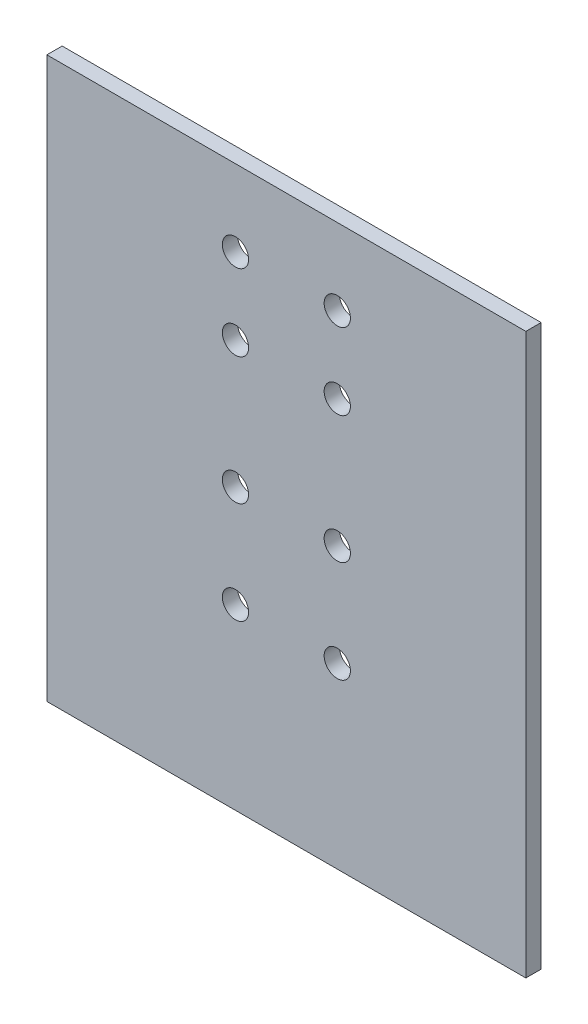
ISO-10303-21;
HEADER;
FILE_DESCRIPTION(('STEP AP214'),'2;1');
FILE_NAME('part.step','',(''),(''),'','','');
FILE_SCHEMA(('AUTOMOTIVE_DESIGN { 1 0 10303 214 1 1 1 1 }'));
ENDSEC;
DATA;
#1=APPLICATION_CONTEXT('core data for automotive mechanical design processes');
#2=APPLICATION_PROTOCOL_DEFINITION('international standard','automotive_design',2000,#1);
#3=PRODUCT_CONTEXT('',#1,'mechanical');
#4=PRODUCT('Part','Part','',(#3));
#5=PRODUCT_RELATED_PRODUCT_CATEGORY('part','',(#4));
#6=PRODUCT_DEFINITION_FORMATION('','',#4);
#7=PRODUCT_DEFINITION_CONTEXT('part definition',#1,'design');
#8=PRODUCT_DEFINITION('design','',#6,#7);
#9=PRODUCT_DEFINITION_SHAPE('','',#8);
#10=(LENGTH_UNIT() NAMED_UNIT(*) SI_UNIT(.MILLI.,.METRE.));
#11=(NAMED_UNIT(*) PLANE_ANGLE_UNIT() SI_UNIT($,.RADIAN.));
#12=(NAMED_UNIT(*) SI_UNIT($,.STERADIAN.) SOLID_ANGLE_UNIT());
#13=UNCERTAINTY_MEASURE_WITH_UNIT(LENGTH_MEASURE(1.E-05),#10,'distance_accuracy_value','');
#14=(GEOMETRIC_REPRESENTATION_CONTEXT(3) GLOBAL_UNCERTAINTY_ASSIGNED_CONTEXT((#13)) GLOBAL_UNIT_ASSIGNED_CONTEXT((#10,
#11,#12)) REPRESENTATION_CONTEXT('',''));
#15=CARTESIAN_POINT('',(0.,0.,0.));
#16=DIRECTION('',(0.,0.,1.));
#17=DIRECTION('',(1.,0.,0.));
#18=AXIS2_PLACEMENT_3D('',#15,#16,#17);
#19=CARTESIAN_POINT('',(0.,0.,-3.));
#20=DIRECTION('',(0.,0.,1.));
#21=DIRECTION('',(1.,0.,0.));
#22=AXIS2_PLACEMENT_3D('',#19,#20,#21);
#23=PLANE('',#22);
#24=CARTESIAN_POINT('',(10.,0.,-3.));
#25=DIRECTION('',(0.,0.,1.));
#26=DIRECTION('',(1.,0.,0.));
#27=AXIS2_PLACEMENT_3D('',#24,#25,#26);
#28=CIRCLE('',#27,2.58);
#29=CARTESIAN_POINT('',(12.58,0.,-3.));
#30=VERTEX_POINT('',#29);
#31=EDGE_CURVE('E200',#30,#30,#28,.T.);
#32=ORIENTED_EDGE('',*,*,#31,.T.);
#33=EDGE_LOOP('',(#32));
#34=FACE_BOUND('',#33,.T.);
#35=CARTESIAN_POINT('',(10.,25.,-3.));
#36=DIRECTION('',(0.,0.,1.));
#37=DIRECTION('',(1.,0.,0.));
#38=AXIS2_PLACEMENT_3D('',#35,#36,#37);
#39=CIRCLE('',#38,2.58);
#40=CARTESIAN_POINT('',(12.58,25.,-3.));
#41=VERTEX_POINT('',#40);
#42=EDGE_CURVE('E191',#41,#41,#39,.T.);
#43=ORIENTED_EDGE('',*,*,#42,.T.);
#44=EDGE_LOOP('',(#43));
#45=FACE_BOUND('',#44,.T.);
#46=CARTESIAN_POINT('',(-10.,25.,-3.));
#47=DIRECTION('',(0.,0.,1.));
#48=DIRECTION('',(1.,0.,0.));
#49=AXIS2_PLACEMENT_3D('',#46,#47,#48);
#50=CIRCLE('',#49,2.58);
#51=CARTESIAN_POINT('',(-7.42,25.,-3.));
#52=VERTEX_POINT('',#51);
#53=EDGE_CURVE('E216',#52,#52,#50,.T.);
#54=ORIENTED_EDGE('',*,*,#53,.T.);
#55=EDGE_LOOP('',(#54));
#56=FACE_BOUND('',#55,.T.);
#57=CARTESIAN_POINT('',(10.,40.,-3.));
#58=DIRECTION('',(0.,0.,1.));
#59=DIRECTION('',(1.,0.,0.));
#60=AXIS2_PLACEMENT_3D('',#57,#58,#59);
#61=CIRCLE('',#60,2.58);
#62=CARTESIAN_POINT('',(12.58,40.,-3.));
#63=VERTEX_POINT('',#62);
#64=EDGE_CURVE('E207',#63,#63,#61,.T.);
#65=ORIENTED_EDGE('',*,*,#64,.T.);
#66=EDGE_LOOP('',(#65));
#67=FACE_BOUND('',#66,.T.);
#68=CARTESIAN_POINT('',(-10.,0.,-3.));
#69=DIRECTION('',(0.,0.,1.));
#70=DIRECTION('',(1.,0.,0.));
#71=AXIS2_PLACEMENT_3D('',#68,#69,#70);
#72=CIRCLE('',#71,2.58);
#73=CARTESIAN_POINT('',(-7.42,0.,-3.));
#74=VERTEX_POINT('',#73);
#75=EDGE_CURVE('E167',#74,#74,#72,.T.);
#76=ORIENTED_EDGE('',*,*,#75,.T.);
#77=EDGE_LOOP('',(#76));
#78=FACE_BOUND('',#77,.T.);
#79=CARTESIAN_POINT('',(-10.,-20.,-3.));
#80=DIRECTION('',(0.,0.,1.));
#81=DIRECTION('',(1.,0.,0.));
#82=AXIS2_PLACEMENT_3D('',#79,#80,#81);
#83=CIRCLE('',#82,2.58);
#84=CARTESIAN_POINT('',(-7.42,-20.,-3.));
#85=VERTEX_POINT('',#84);
#86=EDGE_CURVE('E176',#85,#85,#83,.T.);
#87=ORIENTED_EDGE('',*,*,#86,.T.);
#88=EDGE_LOOP('',(#87));
#89=FACE_BOUND('',#88,.T.);
#90=CARTESIAN_POINT('',(10.,-20.,-3.));
#91=DIRECTION('',(0.,0.,1.));
#92=DIRECTION('',(1.,0.,0.));
#93=AXIS2_PLACEMENT_3D('',#90,#91,#92);
#94=CIRCLE('',#93,2.58);
#95=CARTESIAN_POINT('',(12.58,-20.,-3.));
#96=VERTEX_POINT('',#95);
#97=EDGE_CURVE('E184',#96,#96,#94,.T.);
#98=ORIENTED_EDGE('',*,*,#97,.T.);
#99=EDGE_LOOP('',(#98));
#100=FACE_BOUND('',#99,.T.);
#101=CARTESIAN_POINT('',(-10.,40.,-3.));
#102=DIRECTION('',(0.,0.,1.));
#103=DIRECTION('',(1.,0.,0.));
#104=AXIS2_PLACEMENT_3D('',#101,#102,#103);
#105=CIRCLE('',#104,2.58);
#106=CARTESIAN_POINT('',(-7.42,40.,-3.));
#107=VERTEX_POINT('',#106);
#108=EDGE_CURVE('E137',#107,#107,#105,.T.);
#109=ORIENTED_EDGE('',*,*,#108,.T.);
#110=EDGE_LOOP('',(#109));
#111=FACE_BOUND('',#110,.T.);
#112=DIRECTION('',(-1.,0.,0.));
#113=VECTOR('',#112,1.);
#114=CARTESIAN_POINT('',(-43.,55.,-3.));
#115=LINE('',#114,#113);
#116=CARTESIAN_POINT('',(47.0400430645095,55.,-3.00000000000004));
#117=VERTEX_POINT('',#116);
#118=CARTESIAN_POINT('',(-47.0400430645095,55.,-3.00000000000007));
#119=VERTEX_POINT('',#118);
#120=EDGE_CURVE('E96',#117,#119,#115,.T.);
#121=ORIENTED_EDGE('',*,*,#120,.F.);
#122=DIRECTION('',(0.,-1.,0.));
#123=VECTOR('',#122,1.);
#124=CARTESIAN_POINT('',(47.0400430645095,0.,-3.00000000000005));
#125=LINE('',#124,#123);
#126=CARTESIAN_POINT('',(47.0400430645095,-55.,-3.00000000000006));
#127=VERTEX_POINT('',#126);
#128=EDGE_CURVE('E162',#117,#127,#125,.T.);
#129=ORIENTED_EDGE('',*,*,#128,.T.);
#130=DIRECTION('',(1.,0.,0.));
#131=VECTOR('',#130,1.);
#132=CARTESIAN_POINT('',(-43.,-55.,-3.));
#133=LINE('',#132,#131);
#134=CARTESIAN_POINT('',(-47.0400430645094,-55.,-3.00000000000004));
#135=VERTEX_POINT('',#134);
#136=EDGE_CURVE('E13',#135,#127,#133,.T.);
#137=ORIENTED_EDGE('',*,*,#136,.F.);
#138=DIRECTION('',(0.,1.,0.));
#139=VECTOR('',#138,1.);
#140=CARTESIAN_POINT('',(-47.0400430645095,0.,-3.00000000000005));
#141=LINE('',#140,#139);
#142=EDGE_CURVE('E148',#135,#119,#141,.T.);
#143=ORIENTED_EDGE('',*,*,#142,.T.);
#144=EDGE_LOOP('',(#121,#129,#137,#143));
#145=FACE_BOUND('',#144,.T.);
#146=ADVANCED_FACE('F85',(#34,#45,#56,#67,#78,#89,#100,#111,#145),#23,.F.);
#147=CARTESIAN_POINT('',(0.,0.,0.));
#148=DIRECTION('',(0.,0.,1.));
#149=DIRECTION('',(1.,0.,0.));
#150=AXIS2_PLACEMENT_3D('',#147,#148,#149);
#151=PLANE('',#150);
#152=CARTESIAN_POINT('',(10.,0.,0.));
#153=DIRECTION('',(0.,0.,1.));
#154=DIRECTION('',(1.,0.,0.));
#155=AXIS2_PLACEMENT_3D('',#152,#153,#154);
#156=CIRCLE('',#155,2.58);
#157=CARTESIAN_POINT('',(12.58,0.,0.));
#158=VERTEX_POINT('',#157);
#159=EDGE_CURVE('E171',#158,#158,#156,.T.);
#160=ORIENTED_EDGE('',*,*,#159,.F.);
#161=EDGE_LOOP('',(#160));
#162=FACE_BOUND('',#161,.T.);
#163=CARTESIAN_POINT('',(10.,25.,0.));
#164=DIRECTION('',(0.,0.,1.));
#165=DIRECTION('',(1.,0.,0.));
#166=AXIS2_PLACEMENT_3D('',#163,#164,#165);
#167=CIRCLE('',#166,2.58);
#168=CARTESIAN_POINT('',(12.58,25.,0.));
#169=VERTEX_POINT('',#168);
#170=EDGE_CURVE('E196',#169,#169,#167,.T.);
#171=ORIENTED_EDGE('',*,*,#170,.F.);
#172=EDGE_LOOP('',(#171));
#173=FACE_BOUND('',#172,.T.);
#174=CARTESIAN_POINT('',(-10.,25.,0.));
#175=DIRECTION('',(0.,0.,1.));
#176=DIRECTION('',(1.,0.,0.));
#177=AXIS2_PLACEMENT_3D('',#174,#175,#176);
#178=CIRCLE('',#177,2.58);
#179=CARTESIAN_POINT('',(-7.42,25.,0.));
#180=VERTEX_POINT('',#179);
#181=EDGE_CURVE('E195',#180,#180,#178,.T.);
#182=ORIENTED_EDGE('',*,*,#181,.F.);
#183=EDGE_LOOP('',(#182));
#184=FACE_BOUND('',#183,.T.);
#185=CARTESIAN_POINT('',(10.,40.,0.));
#186=DIRECTION('',(0.,0.,1.));
#187=DIRECTION('',(1.,0.,0.));
#188=AXIS2_PLACEMENT_3D('',#185,#186,#187);
#189=CIRCLE('',#188,2.58);
#190=CARTESIAN_POINT('',(12.58,40.,0.));
#191=VERTEX_POINT('',#190);
#192=EDGE_CURVE('E212',#191,#191,#189,.T.);
#193=ORIENTED_EDGE('',*,*,#192,.F.);
#194=EDGE_LOOP('',(#193));
#195=FACE_BOUND('',#194,.T.);
#196=CARTESIAN_POINT('',(-10.,0.,0.));
#197=DIRECTION('',(0.,0.,1.));
#198=DIRECTION('',(1.,0.,0.));
#199=AXIS2_PLACEMENT_3D('',#196,#197,#198);
#200=CIRCLE('',#199,2.58);
#201=CARTESIAN_POINT('',(-7.42,0.,0.));
#202=VERTEX_POINT('',#201);
#203=EDGE_CURVE('E172',#202,#202,#200,.T.);
#204=ORIENTED_EDGE('',*,*,#203,.F.);
#205=EDGE_LOOP('',(#204));
#206=FACE_BOUND('',#205,.T.);
#207=CARTESIAN_POINT('',(-10.,-20.,0.));
#208=DIRECTION('',(0.,0.,1.));
#209=DIRECTION('',(1.,0.,0.));
#210=AXIS2_PLACEMENT_3D('',#207,#208,#209);
#211=CIRCLE('',#210,2.58);
#212=CARTESIAN_POINT('',(-7.42,-20.,0.));
#213=VERTEX_POINT('',#212);
#214=EDGE_CURVE('E180',#213,#213,#211,.T.);
#215=ORIENTED_EDGE('',*,*,#214,.F.);
#216=EDGE_LOOP('',(#215));
#217=FACE_BOUND('',#216,.T.);
#218=CARTESIAN_POINT('',(10.,-20.,0.));
#219=DIRECTION('',(0.,0.,1.));
#220=DIRECTION('',(1.,0.,0.));
#221=AXIS2_PLACEMENT_3D('',#218,#219,#220);
#222=CIRCLE('',#221,2.58);
#223=CARTESIAN_POINT('',(12.58,-20.,0.));
#224=VERTEX_POINT('',#223);
#225=EDGE_CURVE('E161',#224,#224,#222,.T.);
#226=ORIENTED_EDGE('',*,*,#225,.F.);
#227=EDGE_LOOP('',(#226));
#228=FACE_BOUND('',#227,.T.);
#229=CARTESIAN_POINT('',(-10.,40.,0.));
#230=DIRECTION('',(0.,0.,1.));
#231=DIRECTION('',(1.,0.,0.));
#232=AXIS2_PLACEMENT_3D('',#229,#230,#231);
#233=CIRCLE('',#232,2.58);
#234=CARTESIAN_POINT('',(-7.42,40.,0.));
#235=VERTEX_POINT('',#234);
#236=EDGE_CURVE('E211',#235,#235,#233,.T.);
#237=ORIENTED_EDGE('',*,*,#236,.F.);
#238=EDGE_LOOP('',(#237));
#239=FACE_BOUND('',#238,.T.);
#240=DIRECTION('',(1.,0.,0.));
#241=VECTOR('',#240,1.);
#242=CARTESIAN_POINT('',(-43.,-55.,0.));
#243=LINE('',#242,#241);
#244=CARTESIAN_POINT('',(-47.0400430645095,-55.,0.));
#245=VERTEX_POINT('',#244);
#246=CARTESIAN_POINT('',(47.0400430645095,-55.,0.));
#247=VERTEX_POINT('',#246);
#248=EDGE_CURVE('E89',#245,#247,#243,.T.);
#249=ORIENTED_EDGE('',*,*,#248,.T.);
#250=DIRECTION('',(0.,1.,0.));
#251=VECTOR('',#250,1.);
#252=CARTESIAN_POINT('',(47.0400430645095,-55.,0.));
#253=LINE('',#252,#251);
#254=CARTESIAN_POINT('',(47.0400430645095,55.,0.));
#255=VERTEX_POINT('',#254);
#256=EDGE_CURVE('E135',#255,#247,#253,.F.);
#257=ORIENTED_EDGE('',*,*,#256,.F.);
#258=DIRECTION('',(-1.,0.,0.));
#259=VECTOR('',#258,1.);
#260=CARTESIAN_POINT('',(-43.,55.,0.));
#261=LINE('',#260,#259);
#262=CARTESIAN_POINT('',(-47.0400430645095,55.,0.));
#263=VERTEX_POINT('',#262);
#264=EDGE_CURVE('E105',#255,#263,#261,.T.);
#265=ORIENTED_EDGE('',*,*,#264,.T.);
#266=DIRECTION('',(0.,-1.,0.));
#267=VECTOR('',#266,1.);
#268=CARTESIAN_POINT('',(-47.0400430645095,55.,0.));
#269=LINE('',#268,#267);
#270=EDGE_CURVE('E134',#245,#263,#269,.F.);
#271=ORIENTED_EDGE('',*,*,#270,.F.);
#272=EDGE_LOOP('',(#249,#257,#265,#271));
#273=FACE_BOUND('',#272,.T.);
#274=ADVANCED_FACE('F87',(#162,#173,#184,#195,#206,#217,#228,#239,#273),#151,.T.);
#275=CARTESIAN_POINT('',(-43.,55.,-3.));
#276=DIRECTION('',(0.,1.,0.));
#277=DIRECTION('',(0.,0.,1.));
#278=AXIS2_PLACEMENT_3D('',#275,#276,#277);
#279=PLANE('',#278);
#280=ORIENTED_EDGE('',*,*,#264,.F.);
#281=DIRECTION('',(0.,0.,1.));
#282=VECTOR('',#281,1.);
#283=CARTESIAN_POINT('',(47.0400430645095,55.,-3.00000000000004));
#284=LINE('',#283,#282);
#285=EDGE_CURVE('E152',#117,#255,#284,.T.);
#286=ORIENTED_EDGE('',*,*,#285,.F.);
#287=ORIENTED_EDGE('',*,*,#120,.T.);
#288=DIRECTION('',(0.,0.,1.));
#289=VECTOR('',#288,1.);
#290=CARTESIAN_POINT('',(-47.0400430645095,55.,-3.00000000000007));
#291=LINE('',#290,#289);
#292=EDGE_CURVE('E142',#119,#263,#291,.T.);
#293=ORIENTED_EDGE('',*,*,#292,.T.);
#294=EDGE_LOOP('',(#280,#286,#287,#293));
#295=FACE_BOUND('',#294,.T.);
#296=ADVANCED_FACE('F146',(#295),#279,.T.);
#297=CARTESIAN_POINT('',(-43.,-55.,-3.));
#298=DIRECTION('',(0.,-1.,0.));
#299=DIRECTION('',(0.,0.,-1.));
#300=AXIS2_PLACEMENT_3D('',#297,#298,#299);
#301=PLANE('',#300);
#302=ORIENTED_EDGE('',*,*,#136,.T.);
#303=DIRECTION('',(0.,0.,1.));
#304=VECTOR('',#303,1.);
#305=CARTESIAN_POINT('',(47.0400430645095,-55.,-3.00000000000006));
#306=LINE('',#305,#304);
#307=EDGE_CURVE('E158',#127,#247,#306,.T.);
#308=ORIENTED_EDGE('',*,*,#307,.T.);
#309=ORIENTED_EDGE('',*,*,#248,.F.);
#310=DIRECTION('',(0.,0.,1.));
#311=VECTOR('',#310,1.);
#312=CARTESIAN_POINT('',(-47.0400430645094,-55.,-3.00000000000004));
#313=LINE('',#312,#311);
#314=EDGE_CURVE('E143',#135,#245,#313,.T.);
#315=ORIENTED_EDGE('',*,*,#314,.F.);
#316=EDGE_LOOP('',(#302,#308,#309,#315));
#317=FACE_BOUND('',#316,.T.);
#318=ADVANCED_FACE('F241',(#317),#301,.T.);
#319=CARTESIAN_POINT('',(-10.,40.,-3.));
#320=DIRECTION('',(0.,0.,1.));
#321=DIRECTION('',(1.,0.,0.));
#322=AXIS2_PLACEMENT_3D('',#319,#320,#321);
#323=CYLINDRICAL_SURFACE('',#322,2.58);
#324=ORIENTED_EDGE('',*,*,#108,.F.);
#325=EDGE_LOOP('',(#324));
#326=FACE_BOUND('',#325,.T.);
#327=ORIENTED_EDGE('',*,*,#236,.T.);
#328=EDGE_LOOP('',(#327));
#329=FACE_BOUND('',#328,.T.);
#330=ADVANCED_FACE('F233',(#326,#329),#323,.F.);
#331=CARTESIAN_POINT('',(10.,-20.,-3.));
#332=DIRECTION('',(0.,0.,1.));
#333=DIRECTION('',(1.,0.,0.));
#334=AXIS2_PLACEMENT_3D('',#331,#332,#333);
#335=CYLINDRICAL_SURFACE('',#334,2.58);
#336=ORIENTED_EDGE('',*,*,#97,.F.);
#337=EDGE_LOOP('',(#336));
#338=FACE_BOUND('',#337,.T.);
#339=ORIENTED_EDGE('',*,*,#225,.T.);
#340=EDGE_LOOP('',(#339));
#341=FACE_BOUND('',#340,.T.);
#342=ADVANCED_FACE('F258',(#338,#341),#335,.F.);
#343=CARTESIAN_POINT('',(-10.,-20.,-3.));
#344=DIRECTION('',(0.,0.,1.));
#345=DIRECTION('',(1.,0.,0.));
#346=AXIS2_PLACEMENT_3D('',#343,#344,#345);
#347=CYLINDRICAL_SURFACE('',#346,2.58);
#348=ORIENTED_EDGE('',*,*,#86,.F.);
#349=EDGE_LOOP('',(#348));
#350=FACE_BOUND('',#349,.T.);
#351=ORIENTED_EDGE('',*,*,#214,.T.);
#352=EDGE_LOOP('',(#351));
#353=FACE_BOUND('',#352,.T.);
#354=ADVANCED_FACE('F260',(#350,#353),#347,.F.);
#355=CARTESIAN_POINT('',(-10.,0.,-3.));
#356=DIRECTION('',(0.,0.,1.));
#357=DIRECTION('',(1.,0.,0.));
#358=AXIS2_PLACEMENT_3D('',#355,#356,#357);
#359=CYLINDRICAL_SURFACE('',#358,2.58);
#360=ORIENTED_EDGE('',*,*,#75,.F.);
#361=EDGE_LOOP('',(#360));
#362=FACE_BOUND('',#361,.T.);
#363=ORIENTED_EDGE('',*,*,#203,.T.);
#364=EDGE_LOOP('',(#363));
#365=FACE_BOUND('',#364,.T.);
#366=ADVANCED_FACE('F267',(#362,#365),#359,.F.);
#367=CARTESIAN_POINT('',(10.,40.,-3.));
#368=DIRECTION('',(0.,0.,1.));
#369=DIRECTION('',(1.,0.,0.));
#370=AXIS2_PLACEMENT_3D('',#367,#368,#369);
#371=CYLINDRICAL_SURFACE('',#370,2.58);
#372=ORIENTED_EDGE('',*,*,#64,.F.);
#373=EDGE_LOOP('',(#372));
#374=FACE_BOUND('',#373,.T.);
#375=ORIENTED_EDGE('',*,*,#192,.T.);
#376=EDGE_LOOP('',(#375));
#377=FACE_BOUND('',#376,.T.);
#378=ADVANCED_FACE('F285',(#374,#377),#371,.F.);
#379=CARTESIAN_POINT('',(-10.,25.,-3.));
#380=DIRECTION('',(0.,0.,1.));
#381=DIRECTION('',(1.,0.,0.));
#382=AXIS2_PLACEMENT_3D('',#379,#380,#381);
#383=CYLINDRICAL_SURFACE('',#382,2.58);
#384=ORIENTED_EDGE('',*,*,#53,.F.);
#385=EDGE_LOOP('',(#384));
#386=FACE_BOUND('',#385,.T.);
#387=ORIENTED_EDGE('',*,*,#181,.T.);
#388=EDGE_LOOP('',(#387));
#389=FACE_BOUND('',#388,.T.);
#390=ADVANCED_FACE('F279',(#386,#389),#383,.F.);
#391=CARTESIAN_POINT('',(10.,25.,-3.));
#392=DIRECTION('',(0.,0.,1.));
#393=DIRECTION('',(1.,0.,0.));
#394=AXIS2_PLACEMENT_3D('',#391,#392,#393);
#395=CYLINDRICAL_SURFACE('',#394,2.58);
#396=ORIENTED_EDGE('',*,*,#42,.F.);
#397=EDGE_LOOP('',(#396));
#398=FACE_BOUND('',#397,.T.);
#399=ORIENTED_EDGE('',*,*,#170,.T.);
#400=EDGE_LOOP('',(#399));
#401=FACE_BOUND('',#400,.T.);
#402=ADVANCED_FACE('F275',(#398,#401),#395,.F.);
#403=CARTESIAN_POINT('',(10.,0.,-3.));
#404=DIRECTION('',(0.,0.,1.));
#405=DIRECTION('',(1.,0.,0.));
#406=AXIS2_PLACEMENT_3D('',#403,#404,#405);
#407=CYLINDRICAL_SURFACE('',#406,2.58);
#408=ORIENTED_EDGE('',*,*,#31,.F.);
#409=EDGE_LOOP('',(#408));
#410=FACE_BOUND('',#409,.T.);
#411=ORIENTED_EDGE('',*,*,#159,.T.);
#412=EDGE_LOOP('',(#411));
#413=FACE_BOUND('',#412,.T.);
#414=ADVANCED_FACE('F278',(#410,#413),#407,.F.);
#415=CARTESIAN_POINT('',(47.0400430645095,-55.,-3.00000000000006));
#416=DIRECTION('',(-1.,0.,0.));
#417=DIRECTION('',(0.,0.,1.));
#418=AXIS2_PLACEMENT_3D('',#415,#416,#417);
#419=PLANE('',#418);
#420=ORIENTED_EDGE('',*,*,#256,.T.);
#421=ORIENTED_EDGE('',*,*,#307,.F.);
#422=ORIENTED_EDGE('',*,*,#128,.F.);
#423=ORIENTED_EDGE('',*,*,#285,.T.);
#424=EDGE_LOOP('',(#420,#421,#422,#423));
#425=FACE_BOUND('',#424,.T.);
#426=ADVANCED_FACE('F283',(#425),#419,.F.);
#427=CARTESIAN_POINT('',(-47.0400430645095,55.,-3.00000000000007));
#428=DIRECTION('',(1.,0.,0.));
#429=DIRECTION('',(0.,0.,-1.));
#430=AXIS2_PLACEMENT_3D('',#427,#428,#429);
#431=PLANE('',#430);
#432=ORIENTED_EDGE('',*,*,#270,.T.);
#433=ORIENTED_EDGE('',*,*,#292,.F.);
#434=ORIENTED_EDGE('',*,*,#142,.F.);
#435=ORIENTED_EDGE('',*,*,#314,.T.);
#436=EDGE_LOOP('',(#432,#433,#434,#435));
#437=FACE_BOUND('',#436,.T.);
#438=ADVANCED_FACE('F140',(#437),#431,.F.);
#439=CLOSED_SHELL('',(#146,#274,#296,#318,#330,#342,#354,#366,#378,#390,#402,#414,#426,#438));
#440=MANIFOLD_SOLID_BREP('B2',#439);
#441=ADVANCED_BREP_SHAPE_REPRESENTATION('',(#18,#440),#14);
#442=SHAPE_DEFINITION_REPRESENTATION(#9,#441);
ENDSEC;
END-ISO-10303-21;
